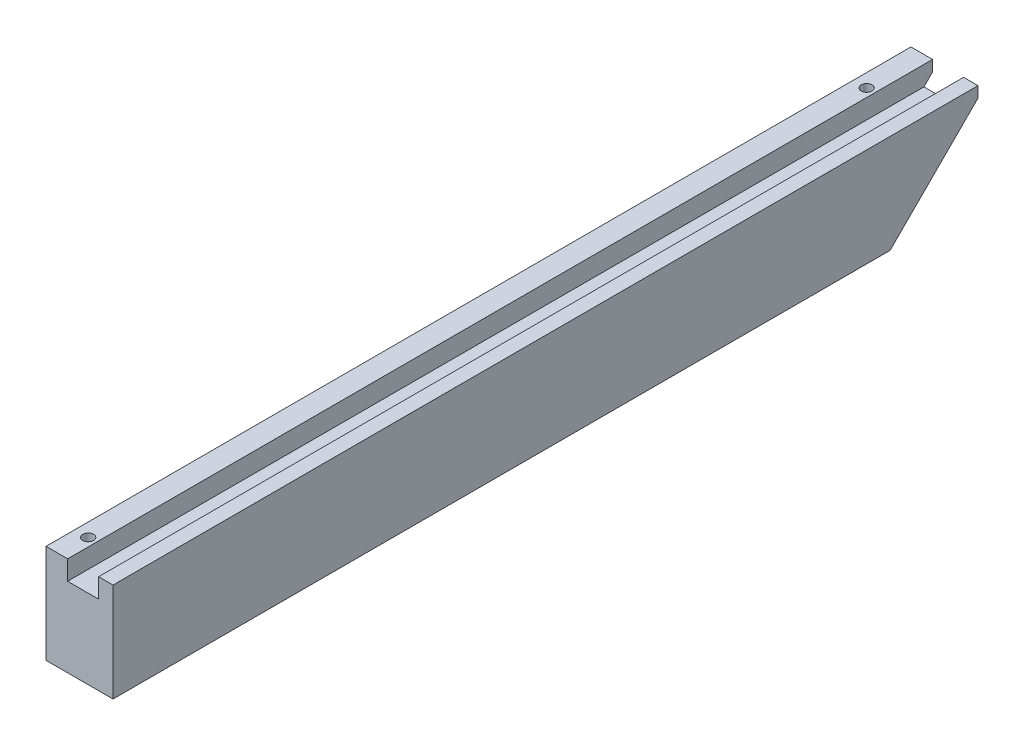
ISO-10303-21;
HEADER;
FILE_DESCRIPTION(('STEP AP214'),'2;1');
FILE_NAME('part.step','',(''),(''),'','','');
FILE_SCHEMA(('AUTOMOTIVE_DESIGN { 1 0 10303 214 1 1 1 1 }'));
ENDSEC;
DATA;
#1=APPLICATION_CONTEXT('core data for automotive mechanical design processes');
#2=APPLICATION_PROTOCOL_DEFINITION('international standard','automotive_design',2000,#1);
#3=PRODUCT_CONTEXT('',#1,'mechanical');
#4=PRODUCT('Part','Part','',(#3));
#5=PRODUCT_RELATED_PRODUCT_CATEGORY('part','',(#4));
#6=PRODUCT_DEFINITION_FORMATION('','',#4);
#7=PRODUCT_DEFINITION_CONTEXT('part definition',#1,'design');
#8=PRODUCT_DEFINITION('design','',#6,#7);
#9=PRODUCT_DEFINITION_SHAPE('','',#8);
#10=(LENGTH_UNIT() NAMED_UNIT(*) SI_UNIT(.MILLI.,.METRE.));
#11=(NAMED_UNIT(*) PLANE_ANGLE_UNIT() SI_UNIT($,.RADIAN.));
#12=(NAMED_UNIT(*) SI_UNIT($,.STERADIAN.) SOLID_ANGLE_UNIT());
#13=UNCERTAINTY_MEASURE_WITH_UNIT(LENGTH_MEASURE(1.E-05),#10,'distance_accuracy_value','');
#14=(GEOMETRIC_REPRESENTATION_CONTEXT(3) GLOBAL_UNCERTAINTY_ASSIGNED_CONTEXT((#13)) GLOBAL_UNIT_ASSIGNED_CONTEXT((#10,
#11,#12)) REPRESENTATION_CONTEXT('',''));
#15=CARTESIAN_POINT('',(0.,0.,0.));
#16=DIRECTION('',(0.,0.,1.));
#17=DIRECTION('',(1.,0.,0.));
#18=AXIS2_PLACEMENT_3D('',#15,#16,#17);
#19=CARTESIAN_POINT('',(0.,0.,0.));
#20=DIRECTION('',(0.,0.,-1.));
#21=DIRECTION('',(-1.,0.,0.));
#22=AXIS2_PLACEMENT_3D('',#19,#20,#21);
#23=PLANE('',#22);
#24=DIRECTION('',(-1.,0.,0.));
#25=VECTOR('',#24,1.);
#26=CARTESIAN_POINT('',(17.2910714285715,4.77857142857141,0.));
#27=LINE('',#26,#25);
#28=CARTESIAN_POINT('',(10.9910714285715,4.77857142857141,0.));
#29=VERTEX_POINT('',#28);
#30=CARTESIAN_POINT('',(7.99107142857145,4.77857142857141,0.));
#31=VERTEX_POINT('',#30);
#32=EDGE_CURVE('E182',#29,#31,#27,.T.);
#33=ORIENTED_EDGE('',*,*,#32,.T.);
#34=DIRECTION('',(0.,-1.,0.));
#35=VECTOR('',#34,1.);
#36=CARTESIAN_POINT('',(7.99107142857145,-7.42142857142859,0.));
#37=LINE('',#36,#35);
#38=CARTESIAN_POINT('',(7.99107142857145,6.27857142857141,0.));
#39=VERTEX_POINT('',#38);
#40=EDGE_CURVE('E136',#39,#31,#37,.T.);
#41=ORIENTED_EDGE('',*,*,#40,.F.);
#42=DIRECTION('',(-1.,0.,0.));
#43=VECTOR('',#42,1.);
#44=CARTESIAN_POINT('',(7.99107142857145,6.27857142857141,0.));
#45=LINE('',#44,#43);
#46=CARTESIAN_POINT('',(10.9910714285715,6.27857142857141,0.));
#47=VERTEX_POINT('',#46);
#48=EDGE_CURVE('E84',#47,#39,#45,.T.);
#49=ORIENTED_EDGE('',*,*,#48,.F.);
#50=DIRECTION('',(0.,1.,0.));
#51=VECTOR('',#50,1.);
#52=CARTESIAN_POINT('',(10.9910714285715,6.27857142857141,0.));
#53=LINE('',#52,#51);
#54=EDGE_CURVE('E147',#29,#47,#53,.T.);
#55=ORIENTED_EDGE('',*,*,#54,.F.);
#56=EDGE_LOOP('',(#33,#41,#49,#55));
#57=FACE_BOUND('',#56,.T.);
#58=ADVANCED_FACE('F38',(#57),#23,.T.);
#59=CARTESIAN_POINT('',(7.99107142857145,-7.42142857142859,120.));
#60=DIRECTION('',(1.,0.,0.));
#61=DIRECTION('',(0.,0.,-1.));
#62=AXIS2_PLACEMENT_3D('',#59,#60,#61);
#63=PLANE('',#62);
#64=ORIENTED_EDGE('',*,*,#40,.T.);
#65=DIRECTION('',(0.,0.707106781186549,-0.707106781186546));
#66=VECTOR('',#65,1.);
#67=CARTESIAN_POINT('',(7.99107142857146,-7.42142857142859,12.2));
#68=LINE('',#67,#66);
#69=CARTESIAN_POINT('',(7.99107142857146,-7.42142857142859,12.2));
#70=VERTEX_POINT('',#69);
#71=EDGE_CURVE('E187',#70,#31,#68,.T.);
#72=ORIENTED_EDGE('',*,*,#71,.F.);
#73=DIRECTION('',(0.,0.,-1.));
#74=VECTOR('',#73,1.);
#75=CARTESIAN_POINT('',(7.99107142857145,-7.42142857142859,120.));
#76=LINE('',#75,#74);
#77=CARTESIAN_POINT('',(7.99107142857145,-7.42142857142859,120.));
#78=VERTEX_POINT('',#77);
#79=EDGE_CURVE('E11',#78,#70,#76,.T.);
#80=ORIENTED_EDGE('',*,*,#79,.F.);
#81=DIRECTION('',(0.,-1.,0.));
#82=VECTOR('',#81,1.);
#83=CARTESIAN_POINT('',(7.99107142857145,-7.42142857142859,120.));
#84=LINE('',#83,#82);
#85=CARTESIAN_POINT('',(7.99107142857145,6.27857142857141,120.));
#86=VERTEX_POINT('',#85);
#87=EDGE_CURVE('E150',#86,#78,#84,.T.);
#88=ORIENTED_EDGE('',*,*,#87,.F.);
#89=DIRECTION('',(0.,0.,-1.));
#90=VECTOR('',#89,1.);
#91=CARTESIAN_POINT('',(7.99107142857145,6.27857142857141,120.));
#92=LINE('',#91,#90);
#93=EDGE_CURVE('E132',#86,#39,#92,.T.);
#94=ORIENTED_EDGE('',*,*,#93,.T.);
#95=EDGE_LOOP('',(#64,#72,#80,#88,#94));
#96=FACE_BOUND('',#95,.T.);
#97=ADVANCED_FACE('F40',(#96),#63,.F.);
#98=CARTESIAN_POINT('',(17.2910714285715,-7.42142857142859,120.));
#99=DIRECTION('',(0.,1.,0.));
#100=DIRECTION('',(-1.,0.,0.));
#101=AXIS2_PLACEMENT_3D('',#98,#99,#100);
#102=PLANE('',#101);
#103=CARTESIAN_POINT('',(9.84107142857146,-7.42142857142859,116.));
#104=DIRECTION('',(0.,1.,0.));
#105=DIRECTION('',(0.,0.,1.));
#106=AXIS2_PLACEMENT_3D('',#103,#104,#105);
#107=CIRCLE('',#106,0.75);
#108=CARTESIAN_POINT('',(9.84107142857146,-7.42142857142859,116.75));
#109=VERTEX_POINT('',#108);
#110=EDGE_CURVE('E196',#109,#109,#107,.T.);
#111=ORIENTED_EDGE('',*,*,#110,.T.);
#112=EDGE_LOOP('',(#111));
#113=FACE_BOUND('',#112,.T.);
#114=ORIENTED_EDGE('',*,*,#79,.T.);
#115=DIRECTION('',(-1.,0.,0.));
#116=VECTOR('',#115,1.);
#117=CARTESIAN_POINT('',(17.2910714285715,-7.42142857142859,12.2));
#118=LINE('',#117,#116);
#119=CARTESIAN_POINT('',(17.2910714285715,-7.42142857142859,12.2));
#120=VERTEX_POINT('',#119);
#121=EDGE_CURVE('E177',#120,#70,#118,.T.);
#122=ORIENTED_EDGE('',*,*,#121,.F.);
#123=DIRECTION('',(0.,0.,-1.));
#124=VECTOR('',#123,1.);
#125=CARTESIAN_POINT('',(17.2910714285715,-7.42142857142859,120.));
#126=LINE('',#125,#124);
#127=CARTESIAN_POINT('',(17.2910714285715,-7.42142857142859,120.));
#128=VERTEX_POINT('',#127);
#129=EDGE_CURVE('E47',#128,#120,#126,.T.);
#130=ORIENTED_EDGE('',*,*,#129,.F.);
#131=DIRECTION('',(1.,0.,0.));
#132=VECTOR('',#131,1.);
#133=CARTESIAN_POINT('',(17.2910714285715,-7.42142857142859,120.));
#134=LINE('',#133,#132);
#135=EDGE_CURVE('E92',#78,#128,#134,.T.);
#136=ORIENTED_EDGE('',*,*,#135,.F.);
#137=EDGE_LOOP('',(#114,#122,#130,#136));
#138=FACE_BOUND('',#137,.T.);
#139=ADVANCED_FACE('F175',(#113,#138),#102,.F.);
#140=CARTESIAN_POINT('',(17.2910714285715,6.27857142857141,120.));
#141=DIRECTION('',(-1.,0.,0.));
#142=DIRECTION('',(0.,0.,1.));
#143=AXIS2_PLACEMENT_3D('',#140,#141,#142);
#144=PLANE('',#143);
#145=ORIENTED_EDGE('',*,*,#129,.T.);
#146=DIRECTION('',(0.,0.707106781186549,-0.707106781186546));
#147=VECTOR('',#146,1.);
#148=CARTESIAN_POINT('',(17.2910714285715,-7.42142857142859,12.2));
#149=LINE('',#148,#147);
#150=CARTESIAN_POINT('',(17.2910714285715,4.77857142857141,0.));
#151=VERTEX_POINT('',#150);
#152=EDGE_CURVE('E168',#120,#151,#149,.T.);
#153=ORIENTED_EDGE('',*,*,#152,.T.);
#154=DIRECTION('',(0.,1.,0.));
#155=VECTOR('',#154,1.);
#156=CARTESIAN_POINT('',(17.2910714285715,6.27857142857141,0.));
#157=LINE('',#156,#155);
#158=CARTESIAN_POINT('',(17.2910714285715,6.27857142857141,0.));
#159=VERTEX_POINT('',#158);
#160=EDGE_CURVE('E139',#151,#159,#157,.T.);
#161=ORIENTED_EDGE('',*,*,#160,.T.);
#162=DIRECTION('',(0.,0.,-1.));
#163=VECTOR('',#162,1.);
#164=CARTESIAN_POINT('',(17.2910714285715,6.27857142857141,120.));
#165=LINE('',#164,#163);
#166=CARTESIAN_POINT('',(17.2910714285715,6.27857142857141,120.));
#167=VERTEX_POINT('',#166);
#168=EDGE_CURVE('E157',#167,#159,#165,.T.);
#169=ORIENTED_EDGE('',*,*,#168,.F.);
#170=DIRECTION('',(0.,1.,0.));
#171=VECTOR('',#170,1.);
#172=CARTESIAN_POINT('',(17.2910714285715,6.27857142857141,120.));
#173=LINE('',#172,#171);
#174=EDGE_CURVE('E171',#128,#167,#173,.T.);
#175=ORIENTED_EDGE('',*,*,#174,.F.);
#176=EDGE_LOOP('',(#145,#153,#161,#169,#175));
#177=FACE_BOUND('',#176,.T.);
#178=ADVANCED_FACE('F165',(#177),#144,.F.);
#179=CARTESIAN_POINT('',(15.2910714285714,6.27857142857141,120.));
#180=DIRECTION('',(0.,-1.,0.));
#181=DIRECTION('',(0.,0.,-1.));
#182=AXIS2_PLACEMENT_3D('',#179,#180,#181);
#183=PLANE('',#182);
#184=DIRECTION('',(-1.,0.,0.));
#185=VECTOR('',#184,1.);
#186=CARTESIAN_POINT('',(15.2910714285714,6.27857142857141,0.));
#187=LINE('',#186,#185);
#188=CARTESIAN_POINT('',(15.2910714285714,6.27857142857141,0.));
#189=VERTEX_POINT('',#188);
#190=EDGE_CURVE('E142',#159,#189,#187,.T.);
#191=ORIENTED_EDGE('',*,*,#190,.T.);
#192=DIRECTION('',(0.,0.,-1.));
#193=VECTOR('',#192,1.);
#194=CARTESIAN_POINT('',(15.2910714285714,6.27857142857141,120.));
#195=LINE('',#194,#193);
#196=CARTESIAN_POINT('',(15.2910714285714,6.27857142857141,120.));
#197=VERTEX_POINT('',#196);
#198=EDGE_CURVE('E154',#197,#189,#195,.T.);
#199=ORIENTED_EDGE('',*,*,#198,.F.);
#200=DIRECTION('',(-1.,0.,0.));
#201=VECTOR('',#200,1.);
#202=CARTESIAN_POINT('',(15.2910714285714,6.27857142857141,120.));
#203=LINE('',#202,#201);
#204=EDGE_CURVE('E206',#167,#197,#203,.T.);
#205=ORIENTED_EDGE('',*,*,#204,.F.);
#206=ORIENTED_EDGE('',*,*,#168,.T.);
#207=EDGE_LOOP('',(#191,#199,#205,#206));
#208=FACE_BOUND('',#207,.T.);
#209=ADVANCED_FACE('F210',(#208),#183,.F.);
#210=CARTESIAN_POINT('',(15.2910714285714,3.57857142857141,120.));
#211=DIRECTION('',(1.,0.,0.));
#212=DIRECTION('',(0.,0.,-1.));
#213=AXIS2_PLACEMENT_3D('',#210,#211,#212);
#214=PLANE('',#213);
#215=DIRECTION('',(0.,-1.,0.));
#216=VECTOR('',#215,1.);
#217=CARTESIAN_POINT('',(15.2910714285714,3.57857142857141,0.));
#218=LINE('',#217,#216);
#219=CARTESIAN_POINT('',(15.2910714285714,4.77857142857141,0.));
#220=VERTEX_POINT('',#219);
#221=EDGE_CURVE('E144',#189,#220,#218,.T.);
#222=ORIENTED_EDGE('',*,*,#221,.T.);
#223=DIRECTION('',(0.,-0.707106781186549,0.707106781186546));
#224=VECTOR('',#223,1.);
#225=CARTESIAN_POINT('',(15.2910714285714,-55.8214285714286,60.5999999999998));
#226=LINE('',#225,#224);
#227=CARTESIAN_POINT('',(15.2910714285714,3.57857142857141,1.19999999999999));
#228=VERTEX_POINT('',#227);
#229=EDGE_CURVE('E54',#220,#228,#226,.T.);
#230=ORIENTED_EDGE('',*,*,#229,.T.);
#231=DIRECTION('',(0.,0.,-1.));
#232=VECTOR('',#231,1.);
#233=CARTESIAN_POINT('',(15.2910714285714,3.57857142857141,120.));
#234=LINE('',#233,#232);
#235=CARTESIAN_POINT('',(15.2910714285714,3.57857142857141,120.));
#236=VERTEX_POINT('',#235);
#237=EDGE_CURVE('E127',#236,#228,#234,.T.);
#238=ORIENTED_EDGE('',*,*,#237,.F.);
#239=DIRECTION('',(0.,-1.,0.));
#240=VECTOR('',#239,1.);
#241=CARTESIAN_POINT('',(15.2910714285714,3.57857142857141,120.));
#242=LINE('',#241,#240);
#243=EDGE_CURVE('E114',#197,#236,#242,.T.);
#244=ORIENTED_EDGE('',*,*,#243,.F.);
#245=ORIENTED_EDGE('',*,*,#198,.T.);
#246=EDGE_LOOP('',(#222,#230,#238,#244,#245));
#247=FACE_BOUND('',#246,.T.);
#248=ADVANCED_FACE('F214',(#247),#214,.F.);
#249=CARTESIAN_POINT('',(10.9910714285715,3.57857142857141,120.));
#250=DIRECTION('',(0.,-1.,0.));
#251=DIRECTION('',(0.,0.,-1.));
#252=AXIS2_PLACEMENT_3D('',#249,#250,#251);
#253=PLANE('',#252);
#254=ORIENTED_EDGE('',*,*,#237,.T.);
#255=DIRECTION('',(-1.,0.,0.));
#256=VECTOR('',#255,1.);
#257=CARTESIAN_POINT('',(10.9910714285715,3.57857142857141,1.19999999999999));
#258=LINE('',#257,#256);
#259=CARTESIAN_POINT('',(10.9910714285715,3.57857142857141,1.19999999999999));
#260=VERTEX_POINT('',#259);
#261=EDGE_CURVE('E124',#228,#260,#258,.T.);
#262=ORIENTED_EDGE('',*,*,#261,.T.);
#263=DIRECTION('',(0.,0.,-1.));
#264=VECTOR('',#263,1.);
#265=CARTESIAN_POINT('',(10.9910714285715,3.57857142857141,120.));
#266=LINE('',#265,#264);
#267=CARTESIAN_POINT('',(10.9910714285715,3.57857142857141,120.));
#268=VERTEX_POINT('',#267);
#269=EDGE_CURVE('E121',#268,#260,#266,.T.);
#270=ORIENTED_EDGE('',*,*,#269,.F.);
#271=DIRECTION('',(-1.,0.,0.));
#272=VECTOR('',#271,1.);
#273=CARTESIAN_POINT('',(10.9910714285715,3.57857142857141,120.));
#274=LINE('',#273,#272);
#275=EDGE_CURVE('E107',#236,#268,#274,.T.);
#276=ORIENTED_EDGE('',*,*,#275,.F.);
#277=EDGE_LOOP('',(#254,#262,#270,#276));
#278=FACE_BOUND('',#277,.T.);
#279=ADVANCED_FACE('F122',(#278),#253,.F.);
#280=CARTESIAN_POINT('',(10.9910714285715,6.27857142857141,120.));
#281=DIRECTION('',(-1.,0.,0.));
#282=DIRECTION('',(0.,0.,1.));
#283=AXIS2_PLACEMENT_3D('',#280,#281,#282);
#284=PLANE('',#283);
#285=ORIENTED_EDGE('',*,*,#269,.T.);
#286=DIRECTION('',(0.,0.707106781186549,-0.707106781186546));
#287=VECTOR('',#286,1.);
#288=CARTESIAN_POINT('',(10.9910714285715,-54.4714285714286,59.2499999999998));
#289=LINE('',#288,#287);
#290=EDGE_CURVE('E191',#260,#29,#289,.T.);
#291=ORIENTED_EDGE('',*,*,#290,.T.);
#292=ORIENTED_EDGE('',*,*,#54,.T.);
#293=DIRECTION('',(0.,0.,-1.));
#294=VECTOR('',#293,1.);
#295=CARTESIAN_POINT('',(10.9910714285715,6.27857142857141,120.));
#296=LINE('',#295,#294);
#297=CARTESIAN_POINT('',(10.9910714285715,6.27857142857141,120.));
#298=VERTEX_POINT('',#297);
#299=EDGE_CURVE('E128',#298,#47,#296,.T.);
#300=ORIENTED_EDGE('',*,*,#299,.F.);
#301=DIRECTION('',(0.,1.,0.));
#302=VECTOR('',#301,1.);
#303=CARTESIAN_POINT('',(10.9910714285715,6.27857142857141,120.));
#304=LINE('',#303,#302);
#305=EDGE_CURVE('E111',#268,#298,#304,.T.);
#306=ORIENTED_EDGE('',*,*,#305,.F.);
#307=EDGE_LOOP('',(#285,#291,#292,#300,#306));
#308=FACE_BOUND('',#307,.T.);
#309=ADVANCED_FACE('F130',(#308),#284,.F.);
#310=CARTESIAN_POINT('',(7.99107142857145,6.27857142857141,120.));
#311=DIRECTION('',(0.,-1.,0.));
#312=DIRECTION('',(1.,0.,0.));
#313=AXIS2_PLACEMENT_3D('',#310,#311,#312);
#314=PLANE('',#313);
#315=CARTESIAN_POINT('',(9.84107142857146,6.2785714285714,116.));
#316=DIRECTION('',(0.,1.,0.));
#317=DIRECTION('',(0.,0.,1.));
#318=AXIS2_PLACEMENT_3D('',#315,#316,#317);
#319=CIRCLE('',#318,0.75);
#320=CARTESIAN_POINT('',(9.84107142857146,6.2785714285714,116.75));
#321=VERTEX_POINT('',#320);
#322=EDGE_CURVE('E195',#321,#321,#319,.T.);
#323=ORIENTED_EDGE('',*,*,#322,.F.);
#324=EDGE_LOOP('',(#323));
#325=FACE_BOUND('',#324,.T.);
#326=CARTESIAN_POINT('',(9.84107142857145,6.2785714285714,8.));
#327=DIRECTION('',(0.,1.,0.));
#328=DIRECTION('',(0.,0.,1.));
#329=AXIS2_PLACEMENT_3D('',#326,#327,#328);
#330=CIRCLE('',#329,0.75);
#331=CARTESIAN_POINT('',(9.84107142857145,6.2785714285714,8.75));
#332=VERTEX_POINT('',#331);
#333=EDGE_CURVE('E140',#332,#332,#330,.T.);
#334=ORIENTED_EDGE('',*,*,#333,.F.);
#335=EDGE_LOOP('',(#334));
#336=FACE_BOUND('',#335,.T.);
#337=ORIENTED_EDGE('',*,*,#48,.T.);
#338=ORIENTED_EDGE('',*,*,#93,.F.);
#339=DIRECTION('',(-1.,0.,0.));
#340=VECTOR('',#339,1.);
#341=CARTESIAN_POINT('',(7.99107142857145,6.27857142857141,120.));
#342=LINE('',#341,#340);
#343=EDGE_CURVE('E63',#298,#86,#342,.T.);
#344=ORIENTED_EDGE('',*,*,#343,.F.);
#345=ORIENTED_EDGE('',*,*,#299,.T.);
#346=EDGE_LOOP('',(#337,#338,#344,#345));
#347=FACE_BOUND('',#346,.T.);
#348=ADVANCED_FACE('F254',(#325,#336,#347),#314,.F.);
#349=CARTESIAN_POINT('',(0.,0.,120.));
#350=DIRECTION('',(0.,0.,-1.));
#351=DIRECTION('',(-1.,0.,0.));
#352=AXIS2_PLACEMENT_3D('',#349,#350,#351);
#353=PLANE('',#352);
#354=ORIENTED_EDGE('',*,*,#87,.T.);
#355=ORIENTED_EDGE('',*,*,#135,.T.);
#356=ORIENTED_EDGE('',*,*,#174,.T.);
#357=ORIENTED_EDGE('',*,*,#204,.T.);
#358=ORIENTED_EDGE('',*,*,#243,.T.);
#359=ORIENTED_EDGE('',*,*,#275,.T.);
#360=ORIENTED_EDGE('',*,*,#305,.T.);
#361=ORIENTED_EDGE('',*,*,#343,.T.);
#362=EDGE_LOOP('',(#354,#355,#356,#357,#358,#359,#360,#361));
#363=FACE_BOUND('',#362,.T.);
#364=ADVANCED_FACE('F109',(#363),#353,.F.);
#365=EDGE_CURVE('E185',#151,#220,#27,.T.);
#366=ORIENTED_EDGE('',*,*,#365,.T.);
#367=ORIENTED_EDGE('',*,*,#221,.F.);
#368=ORIENTED_EDGE('',*,*,#190,.F.);
#369=ORIENTED_EDGE('',*,*,#160,.F.);
#370=EDGE_LOOP('',(#366,#367,#368,#369));
#371=FACE_BOUND('',#370,.T.);
#372=ADVANCED_FACE('F241',(#371),#23,.T.);
#373=CARTESIAN_POINT('',(9.84107142857145,-7.42142857142859,8.));
#374=DIRECTION('',(0.,1.,0.));
#375=DIRECTION('',(0.,0.,1.));
#376=AXIS2_PLACEMENT_3D('',#373,#374,#375);
#377=CYLINDRICAL_SURFACE('',#376,0.75);
#378=CARTESIAN_POINT('',(9.84107142857145,-3.22142857142862,8.));
#379=DIRECTION('',(0.,0.707106781186546,0.707106781186549));
#380=DIRECTION('',(0.,0.707106781186549,-0.707106781186546));
#381=AXIS2_PLACEMENT_3D('',#378,#379,#380);
#382=ELLIPSE('',#381,1.06066017177982,0.75);
#383=CARTESIAN_POINT('',(9.84107142857145,-2.47142857142862,7.25));
#384=VERTEX_POINT('',#383);
#385=EDGE_CURVE('E42',#384,#384,#382,.F.);
#386=ORIENTED_EDGE('',*,*,#385,.T.);
#387=EDGE_LOOP('',(#386));
#388=FACE_BOUND('',#387,.T.);
#389=ORIENTED_EDGE('',*,*,#333,.T.);
#390=EDGE_LOOP('',(#389));
#391=FACE_BOUND('',#390,.T.);
#392=ADVANCED_FACE('F227',(#388,#391),#377,.F.);
#393=CARTESIAN_POINT('',(9.84107142857146,-7.42142857142859,116.));
#394=DIRECTION('',(0.,1.,0.));
#395=DIRECTION('',(0.,0.,1.));
#396=AXIS2_PLACEMENT_3D('',#393,#394,#395);
#397=CYLINDRICAL_SURFACE('',#396,0.75);
#398=ORIENTED_EDGE('',*,*,#110,.F.);
#399=EDGE_LOOP('',(#398));
#400=FACE_BOUND('',#399,.T.);
#401=ORIENTED_EDGE('',*,*,#322,.T.);
#402=EDGE_LOOP('',(#401));
#403=FACE_BOUND('',#402,.T.);
#404=ADVANCED_FACE('F231',(#400,#403),#397,.F.);
#405=CARTESIAN_POINT('',(17.2910714285715,-7.42142857142859,12.2));
#406=DIRECTION('',(0.,0.707106781186546,0.707106781186549));
#407=DIRECTION('',(0.,-0.707106781186549,0.707106781186546));
#408=AXIS2_PLACEMENT_3D('',#405,#406,#407);
#409=PLANE('',#408);
#410=ORIENTED_EDGE('',*,*,#385,.F.);
#411=EDGE_LOOP('',(#410));
#412=FACE_BOUND('',#411,.T.);
#413=ORIENTED_EDGE('',*,*,#365,.F.);
#414=ORIENTED_EDGE('',*,*,#152,.F.);
#415=ORIENTED_EDGE('',*,*,#121,.T.);
#416=ORIENTED_EDGE('',*,*,#71,.T.);
#417=ORIENTED_EDGE('',*,*,#32,.F.);
#418=ORIENTED_EDGE('',*,*,#290,.F.);
#419=ORIENTED_EDGE('',*,*,#261,.F.);
#420=ORIENTED_EDGE('',*,*,#229,.F.);
#421=EDGE_LOOP('',(#413,#414,#415,#416,#417,#418,#419,#420));
#422=FACE_BOUND('',#421,.T.);
#423=ADVANCED_FACE('F222',(#412,#422),#409,.F.);
#424=CLOSED_SHELL('',(#58,#97,#139,#178,#209,#248,#279,#309,#348,#364,#372,#392,#404,#423));
#425=MANIFOLD_SOLID_BREP('B2',#424);
#426=ADVANCED_BREP_SHAPE_REPRESENTATION('',(#18,#425),#14);
#427=SHAPE_DEFINITION_REPRESENTATION(#9,#426);
ENDSEC;
END-ISO-10303-21;
